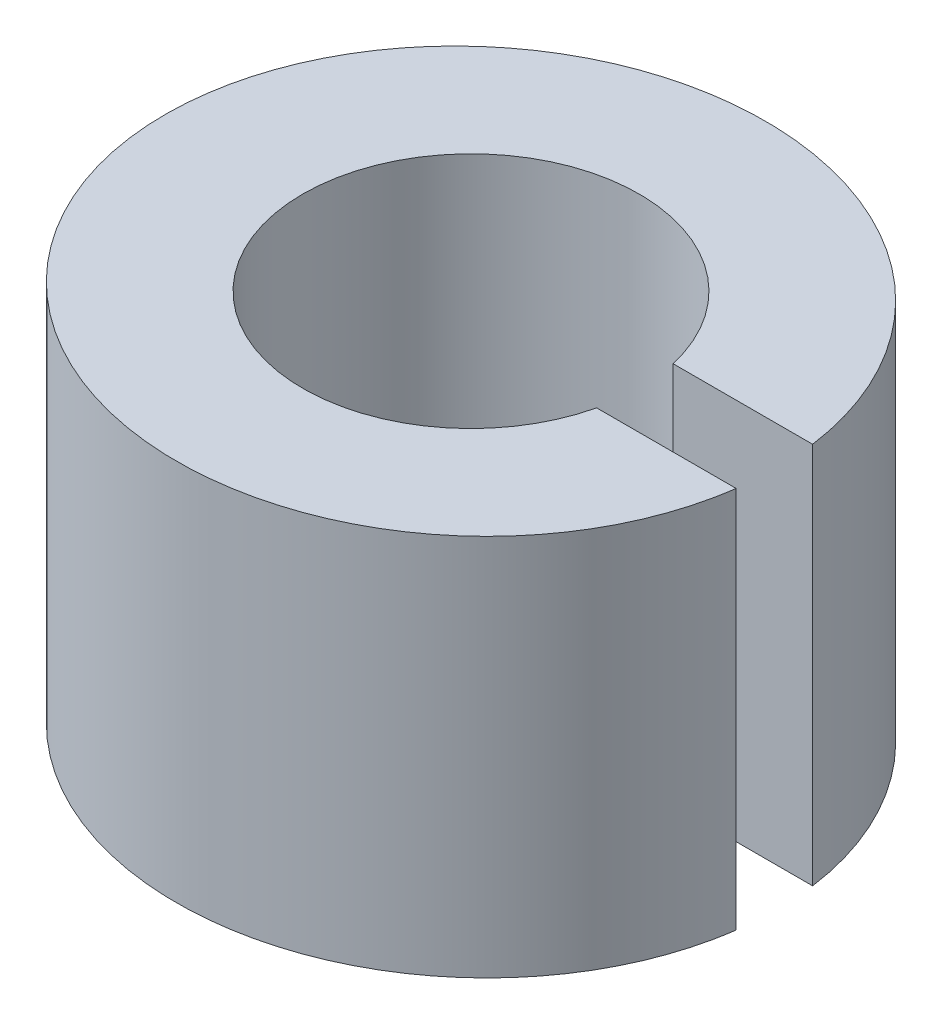
ISO-10303-21;
HEADER;
FILE_DESCRIPTION(('STEP AP214'),'2;1');
FILE_NAME('part.step','',(''),(''),'','','');
FILE_SCHEMA(('AUTOMOTIVE_DESIGN { 1 0 10303 214 1 1 1 1 }'));
ENDSEC;
DATA;
#1=APPLICATION_CONTEXT('core data for automotive mechanical design processes');
#2=APPLICATION_PROTOCOL_DEFINITION('international standard','automotive_design',2000,#1);
#3=PRODUCT_CONTEXT('',#1,'mechanical');
#4=PRODUCT('Part','Part','',(#3));
#5=PRODUCT_RELATED_PRODUCT_CATEGORY('part','',(#4));
#6=PRODUCT_DEFINITION_FORMATION('','',#4);
#7=PRODUCT_DEFINITION_CONTEXT('part definition',#1,'design');
#8=PRODUCT_DEFINITION('design','',#6,#7);
#9=PRODUCT_DEFINITION_SHAPE('','',#8);
#10=(LENGTH_UNIT() NAMED_UNIT(*) SI_UNIT(.MILLI.,.METRE.));
#11=(NAMED_UNIT(*) PLANE_ANGLE_UNIT() SI_UNIT($,.RADIAN.));
#12=(NAMED_UNIT(*) SI_UNIT($,.STERADIAN.) SOLID_ANGLE_UNIT());
#13=UNCERTAINTY_MEASURE_WITH_UNIT(LENGTH_MEASURE(1.E-05),#10,'distance_accuracy_value','');
#14=(GEOMETRIC_REPRESENTATION_CONTEXT(3) GLOBAL_UNCERTAINTY_ASSIGNED_CONTEXT((#13)) GLOBAL_UNIT_ASSIGNED_CONTEXT((#10,
#11,#12)) REPRESENTATION_CONTEXT('',''));
#15=CARTESIAN_POINT('',(0.,0.,0.));
#16=DIRECTION('',(0.,0.,1.));
#17=DIRECTION('',(1.,0.,0.));
#18=AXIS2_PLACEMENT_3D('',#15,#16,#17);
#19=CARTESIAN_POINT('',(0.,6.35,-0.635));
#20=DIRECTION('',(0.,0.,-1.));
#21=DIRECTION('',(-1.,0.,0.));
#22=AXIS2_PLACEMENT_3D('',#19,#20,#21);
#23=PLANE('',#22);
#24=DIRECTION('',(1.,0.,0.));
#25=VECTOR('',#24,1.);
#26=CARTESIAN_POINT('',(0.,0.,-0.635));
#27=LINE('',#26,#25);
#28=CARTESIAN_POINT('',(2.72088423127483,0.,-0.635));
#29=VERTEX_POINT('',#28);
#30=CARTESIAN_POINT('',(5.03697754508374,0.,-0.635));
#31=VERTEX_POINT('',#30);
#32=EDGE_CURVE('E100',#29,#31,#27,.T.);
#33=ORIENTED_EDGE('',*,*,#32,.T.);
#34=DIRECTION('',(0.,-1.,0.));
#35=VECTOR('',#34,1.);
#36=CARTESIAN_POINT('',(5.03697754508374,6.35,-0.635));
#37=LINE('',#36,#35);
#38=CARTESIAN_POINT('',(5.03697754508374,6.35,-0.635));
#39=VERTEX_POINT('',#38);
#40=EDGE_CURVE('E11',#39,#31,#37,.T.);
#41=ORIENTED_EDGE('',*,*,#40,.F.);
#42=DIRECTION('',(1.,0.,0.));
#43=VECTOR('',#42,1.);
#44=CARTESIAN_POINT('',(0.,6.35,-0.635));
#45=LINE('',#44,#43);
#46=CARTESIAN_POINT('',(2.72088423127483,6.35,-0.635));
#47=VERTEX_POINT('',#46);
#48=EDGE_CURVE('E85',#47,#39,#45,.T.);
#49=ORIENTED_EDGE('',*,*,#48,.F.);
#50=DIRECTION('',(0.,-1.,0.));
#51=VECTOR('',#50,1.);
#52=CARTESIAN_POINT('',(2.72088423127483,6.35,-0.635));
#53=LINE('',#52,#51);
#54=EDGE_CURVE('E52',#47,#29,#53,.T.);
#55=ORIENTED_EDGE('',*,*,#54,.T.);
#56=EDGE_LOOP('',(#33,#41,#49,#55));
#57=FACE_BOUND('',#56,.T.);
#58=ADVANCED_FACE('F36',(#57),#23,.F.);
#59=CARTESIAN_POINT('',(0.,6.35,0.));
#60=DIRECTION('',(0.,1.,0.));
#61=DIRECTION('',(-1.,0.,0.));
#62=AXIS2_PLACEMENT_3D('',#59,#60,#61);
#63=ELLIPSE('',#62,5.08,4.8895);
#64=DIRECTION('',(0.,-1.,0.));
#65=VECTOR('',#64,1.);
#66=SURFACE_OF_LINEAR_EXTRUSION('',#63,#65);
#67=CARTESIAN_POINT('',(0.,0.,0.));
#68=DIRECTION('',(0.,1.,0.));
#69=DIRECTION('',(-1.,0.,0.));
#70=AXIS2_PLACEMENT_3D('',#67,#68,#69);
#71=ELLIPSE('',#70,5.08,4.8895);
#72=CARTESIAN_POINT('',(5.03697754508374,0.,0.635));
#73=VERTEX_POINT('',#72);
#74=EDGE_CURVE('E90',#31,#73,#71,.T.);
#75=ORIENTED_EDGE('',*,*,#74,.T.);
#76=DIRECTION('',(0.,-1.,0.));
#77=VECTOR('',#76,1.);
#78=CARTESIAN_POINT('',(5.03697754508374,6.35,0.635));
#79=LINE('',#78,#77);
#80=CARTESIAN_POINT('',(5.03697754508374,6.35,0.635));
#81=VERTEX_POINT('',#80);
#82=EDGE_CURVE('E44',#81,#73,#79,.T.);
#83=ORIENTED_EDGE('',*,*,#82,.F.);
#84=EDGE_CURVE('E77',#39,#81,#63,.T.);
#85=ORIENTED_EDGE('',*,*,#84,.F.);
#86=ORIENTED_EDGE('',*,*,#40,.T.);
#87=EDGE_LOOP('',(#75,#83,#85,#86));
#88=FACE_BOUND('',#87,.T.);
#89=ADVANCED_FACE('F89',(#88),#66,.F.);
#90=CARTESIAN_POINT('',(0.,6.35,0.635));
#91=DIRECTION('',(0.,0.,-1.));
#92=DIRECTION('',(-1.,0.,0.));
#93=AXIS2_PLACEMENT_3D('',#90,#91,#92);
#94=PLANE('',#93);
#95=DIRECTION('',(1.,0.,0.));
#96=VECTOR('',#95,1.);
#97=CARTESIAN_POINT('',(0.,0.,0.635));
#98=LINE('',#97,#96);
#99=CARTESIAN_POINT('',(2.72088423127483,0.,0.635));
#100=VERTEX_POINT('',#99);
#101=EDGE_CURVE('E103',#100,#73,#98,.T.);
#102=ORIENTED_EDGE('',*,*,#101,.F.);
#103=DIRECTION('',(0.,-1.,0.));
#104=VECTOR('',#103,1.);
#105=CARTESIAN_POINT('',(2.72088423127483,6.35,0.635));
#106=LINE('',#105,#104);
#107=CARTESIAN_POINT('',(2.72088423127483,6.35,0.635));
#108=VERTEX_POINT('',#107);
#109=EDGE_CURVE('E66',#108,#100,#106,.T.);
#110=ORIENTED_EDGE('',*,*,#109,.F.);
#111=DIRECTION('',(1.,0.,0.));
#112=VECTOR('',#111,1.);
#113=CARTESIAN_POINT('',(0.,6.35,0.635));
#114=LINE('',#113,#112);
#115=EDGE_CURVE('E84',#108,#81,#114,.T.);
#116=ORIENTED_EDGE('',*,*,#115,.T.);
#117=ORIENTED_EDGE('',*,*,#82,.T.);
#118=EDGE_LOOP('',(#102,#110,#116,#117));
#119=FACE_BOUND('',#118,.T.);
#120=ADVANCED_FACE('F93',(#119),#94,.T.);
#121=CARTESIAN_POINT('',(0.,6.35,0.));
#122=DIRECTION('',(0.,-1.,0.));
#123=DIRECTION('',(0.,0.,-1.));
#124=AXIS2_PLACEMENT_3D('',#121,#122,#123);
#125=CYLINDRICAL_SURFACE('',#124,2.794);
#126=CARTESIAN_POINT('',(0.,0.,0.));
#127=DIRECTION('',(0.,1.,0.));
#128=DIRECTION('',(0.,0.,1.));
#129=AXIS2_PLACEMENT_3D('',#126,#127,#128);
#130=CIRCLE('',#129,2.794);
#131=EDGE_CURVE('E105',#29,#100,#130,.T.);
#132=ORIENTED_EDGE('',*,*,#131,.F.);
#133=ORIENTED_EDGE('',*,*,#54,.F.);
#134=CARTESIAN_POINT('',(0.,6.35,0.));
#135=DIRECTION('',(0.,1.,0.));
#136=DIRECTION('',(0.,0.,1.));
#137=AXIS2_PLACEMENT_3D('',#134,#135,#136);
#138=CIRCLE('',#137,2.794);
#139=EDGE_CURVE('E94',#47,#108,#138,.T.);
#140=ORIENTED_EDGE('',*,*,#139,.T.);
#141=ORIENTED_EDGE('',*,*,#109,.T.);
#142=EDGE_LOOP('',(#132,#133,#140,#141));
#143=FACE_BOUND('',#142,.T.);
#144=ADVANCED_FACE('F111',(#143),#125,.F.);
#145=CARTESIAN_POINT('',(0.,6.35,0.));
#146=DIRECTION('',(0.,1.,0.));
#147=DIRECTION('',(0.,0.,1.));
#148=AXIS2_PLACEMENT_3D('',#145,#146,#147);
#149=PLANE('',#148);
#150=ORIENTED_EDGE('',*,*,#48,.T.);
#151=ORIENTED_EDGE('',*,*,#84,.T.);
#152=ORIENTED_EDGE('',*,*,#115,.F.);
#153=ORIENTED_EDGE('',*,*,#139,.F.);
#154=EDGE_LOOP('',(#150,#151,#152,#153));
#155=FACE_BOUND('',#154,.T.);
#156=ADVANCED_FACE('F81',(#155),#149,.T.);
#157=CARTESIAN_POINT('',(0.,0.,0.));
#158=DIRECTION('',(0.,1.,0.));
#159=DIRECTION('',(0.,0.,1.));
#160=AXIS2_PLACEMENT_3D('',#157,#158,#159);
#161=PLANE('',#160);
#162=ORIENTED_EDGE('',*,*,#32,.F.);
#163=ORIENTED_EDGE('',*,*,#131,.T.);
#164=ORIENTED_EDGE('',*,*,#101,.T.);
#165=ORIENTED_EDGE('',*,*,#74,.F.);
#166=EDGE_LOOP('',(#162,#163,#164,#165));
#167=FACE_BOUND('',#166,.T.);
#168=ADVANCED_FACE('F110',(#167),#161,.F.);
#169=CLOSED_SHELL('',(#58,#89,#120,#144,#156,#168));
#170=MANIFOLD_SOLID_BREP('B2',#169);
#171=ADVANCED_BREP_SHAPE_REPRESENTATION('',(#18,#170),#14);
#172=SHAPE_DEFINITION_REPRESENTATION(#9,#171);
ENDSEC;
END-ISO-10303-21;
